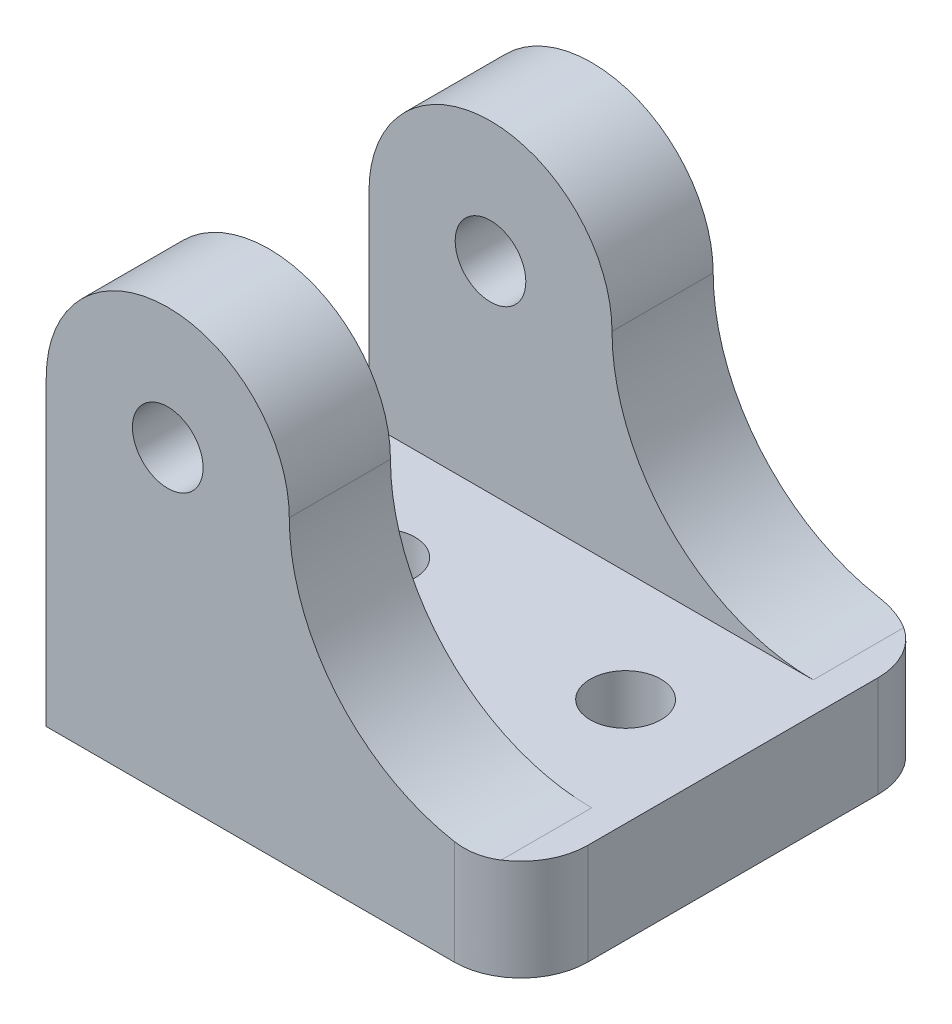
ISO-10303-21;
HEADER;
FILE_DESCRIPTION(('STEP AP214'),'2;1');
FILE_NAME('part.step','',(''),(''),'','','');
FILE_SCHEMA(('AUTOMOTIVE_DESIGN { 1 0 10303 214 1 1 1 1 }'));
ENDSEC;
DATA;
#1=APPLICATION_CONTEXT('core data for automotive mechanical design processes');
#2=APPLICATION_PROTOCOL_DEFINITION('international standard','automotive_design',2000,#1);
#3=PRODUCT_CONTEXT('',#1,'mechanical');
#4=PRODUCT('Part','Part','',(#3));
#5=PRODUCT_RELATED_PRODUCT_CATEGORY('part','',(#4));
#6=PRODUCT_DEFINITION_FORMATION('','',#4);
#7=PRODUCT_DEFINITION_CONTEXT('part definition',#1,'design');
#8=PRODUCT_DEFINITION('design','',#6,#7);
#9=PRODUCT_DEFINITION_SHAPE('','',#8);
#10=(LENGTH_UNIT() NAMED_UNIT(*) SI_UNIT(.MILLI.,.METRE.));
#11=(NAMED_UNIT(*) PLANE_ANGLE_UNIT() SI_UNIT($,.RADIAN.));
#12=(NAMED_UNIT(*) SI_UNIT($,.STERADIAN.) SOLID_ANGLE_UNIT());
#13=UNCERTAINTY_MEASURE_WITH_UNIT(LENGTH_MEASURE(1.E-05),#10,'distance_accuracy_value','');
#14=(GEOMETRIC_REPRESENTATION_CONTEXT(3) GLOBAL_UNCERTAINTY_ASSIGNED_CONTEXT((#13)) GLOBAL_UNIT_ASSIGNED_CONTEXT((#10,
#11,#12)) REPRESENTATION_CONTEXT('',''));
#15=CARTESIAN_POINT('',(0.,0.,0.));
#16=DIRECTION('',(0.,0.,1.));
#17=DIRECTION('',(1.,0.,0.));
#18=AXIS2_PLACEMENT_3D('',#15,#16,#17);
#19=CARTESIAN_POINT('',(-0.0100000000000031,9.09320000000001,-29.0068));
#20=DIRECTION('',(0.,0.,-1.));
#21=DIRECTION('',(-1.,0.,0.));
#22=AXIS2_PLACEMENT_3D('',#19,#20,#21);
#23=PLANE('',#22);
#24=CARTESIAN_POINT('',(10.922,27.178,-29.0068));
#25=DIRECTION('',(0.,0.,-1.));
#26=DIRECTION('',(-1.,0.,0.));
#27=AXIS2_PLACEMENT_3D('',#24,#25,#26);
#28=CIRCLE('',#27,10.922);
#29=CARTESIAN_POINT('',(0.,27.178,-29.0068));
#30=VERTEX_POINT('',#29);
#31=CARTESIAN_POINT('',(21.844,27.178,-29.0068));
#32=VERTEX_POINT('',#31);
#33=EDGE_CURVE('E225',#30,#32,#28,.T.);
#34=ORIENTED_EDGE('',*,*,#33,.F.);
#35=DIRECTION('',(0.,1.,0.));
#36=VECTOR('',#35,1.);
#37=CARTESIAN_POINT('',(0.,38.1,-29.0068));
#38=LINE('',#37,#36);
#39=CARTESIAN_POINT('',(0.,9.09320000000001,-29.0068));
#40=VERTEX_POINT('',#39);
#41=EDGE_CURVE('E253',#40,#30,#38,.T.);
#42=ORIENTED_EDGE('',*,*,#41,.F.);
#43=DIRECTION('',(1.,0.,0.));
#44=VECTOR('',#43,1.);
#45=CARTESIAN_POINT('',(-0.0100000000000031,9.09320000000001,-29.0068));
#46=LINE('',#45,#44);
#47=CARTESIAN_POINT('',(39.9288,9.0932,-29.0068));
#48=VERTEX_POINT('',#47);
#49=EDGE_CURVE('E11',#40,#48,#46,.T.);
#50=ORIENTED_EDGE('',*,*,#49,.T.);
#51=CARTESIAN_POINT('',(39.9288,27.178,-29.0068));
#52=DIRECTION('',(0.,0.,-1.));
#53=DIRECTION('',(-1.,0.,0.));
#54=AXIS2_PLACEMENT_3D('',#51,#52,#53);
#55=CIRCLE('',#54,18.0848);
#56=EDGE_CURVE('E236',#32,#48,#55,.F.);
#57=ORIENTED_EDGE('',*,*,#56,.F.);
#58=EDGE_LOOP('',(#34,#42,#50,#57));
#59=FACE_BOUND('',#58,.T.);
#60=CARTESIAN_POINT('',(10.922,27.178,-29.0068));
#61=DIRECTION('',(0.,0.,-1.));
#62=DIRECTION('',(-1.,0.,0.));
#63=AXIS2_PLACEMENT_3D('',#60,#61,#62);
#64=CIRCLE('',#63,3.175);
#65=CARTESIAN_POINT('',(7.747,27.178,-29.0068));
#66=VERTEX_POINT('',#65);
#67=EDGE_CURVE('E229',#66,#66,#64,.F.);
#68=ORIENTED_EDGE('',*,*,#67,.F.);
#69=EDGE_LOOP('',(#68));
#70=FACE_BOUND('',#69,.T.);
#71=ADVANCED_FACE('F39',(#59,#70),#23,.F.);
#72=CARTESIAN_POINT('',(-0.0100000000000031,9.0932,-9.0932));
#73=DIRECTION('',(0.,0.,1.));
#74=DIRECTION('',(1.,0.,0.));
#75=AXIS2_PLACEMENT_3D('',#72,#73,#74);
#76=PLANE('',#75);
#77=DIRECTION('',(1.,0.,0.));
#78=VECTOR('',#77,1.);
#79=CARTESIAN_POINT('',(-0.0100000000000031,9.0932,-9.0932));
#80=LINE('',#79,#78);
#81=CARTESIAN_POINT('',(0.,9.0932,-9.0932));
#82=VERTEX_POINT('',#81);
#83=CARTESIAN_POINT('',(39.9288,9.0932,-9.0932));
#84=VERTEX_POINT('',#83);
#85=EDGE_CURVE('E49',#82,#84,#80,.T.);
#86=ORIENTED_EDGE('',*,*,#85,.F.);
#87=DIRECTION('',(0.,-1.,0.));
#88=VECTOR('',#87,1.);
#89=CARTESIAN_POINT('',(0.,38.1,-9.0932));
#90=LINE('',#89,#88);
#91=CARTESIAN_POINT('',(0.,27.178,-9.0932));
#92=VERTEX_POINT('',#91);
#93=EDGE_CURVE('E246',#92,#82,#90,.T.);
#94=ORIENTED_EDGE('',*,*,#93,.F.);
#95=CARTESIAN_POINT('',(10.922,27.178,-9.0932));
#96=DIRECTION('',(0.,0.,1.));
#97=DIRECTION('',(1.,0.,0.));
#98=AXIS2_PLACEMENT_3D('',#95,#96,#97);
#99=CIRCLE('',#98,10.922);
#100=CARTESIAN_POINT('',(21.844,27.178,-9.0932));
#101=VERTEX_POINT('',#100);
#102=EDGE_CURVE('E240',#101,#92,#99,.T.);
#103=ORIENTED_EDGE('',*,*,#102,.F.);
#104=CARTESIAN_POINT('',(39.9288,27.178,-9.0932));
#105=DIRECTION('',(0.,0.,1.));
#106=DIRECTION('',(1.,0.,0.));
#107=AXIS2_PLACEMENT_3D('',#104,#105,#106);
#108=CIRCLE('',#107,18.0848);
#109=EDGE_CURVE('E231',#84,#101,#108,.F.);
#110=ORIENTED_EDGE('',*,*,#109,.F.);
#111=EDGE_LOOP('',(#86,#94,#103,#110));
#112=FACE_BOUND('',#111,.T.);
#113=CARTESIAN_POINT('',(10.922,27.178,-9.0932));
#114=DIRECTION('',(0.,0.,1.));
#115=DIRECTION('',(1.,0.,0.));
#116=AXIS2_PLACEMENT_3D('',#113,#114,#115);
#117=CIRCLE('',#116,3.175);
#118=CARTESIAN_POINT('',(14.097,27.178,-9.0932));
#119=VERTEX_POINT('',#118);
#120=EDGE_CURVE('E43',#119,#119,#117,.F.);
#121=ORIENTED_EDGE('',*,*,#120,.F.);
#122=EDGE_LOOP('',(#121));
#123=FACE_BOUND('',#122,.T.);
#124=ADVANCED_FACE('F41',(#112,#123),#76,.F.);
#125=CARTESIAN_POINT('',(39.9288,27.178,-38.11));
#126=DIRECTION('',(0.,0.,1.));
#127=DIRECTION('',(1.,0.,0.));
#128=AXIS2_PLACEMENT_3D('',#125,#126,#127);
#129=CYLINDRICAL_SURFACE('',#128,18.0848);
#130=DIRECTION('',(0.,0.,1.));
#131=VECTOR('',#130,1.);
#132=CARTESIAN_POINT('',(39.9288,9.0932,-38.11));
#133=LINE('',#132,#131);
#134=CARTESIAN_POINT('',(39.9288,9.0932,-0.960828068025463));
#135=VERTEX_POINT('',#134);
#136=EDGE_CURVE('E288',#84,#135,#133,.T.);
#137=ORIENTED_EDGE('',*,*,#136,.F.);
#138=ORIENTED_EDGE('',*,*,#109,.T.);
#139=DIRECTION('',(0.,0.,1.));
#140=VECTOR('',#139,1.);
#141=CARTESIAN_POINT('',(21.844,27.178,-38.11));
#142=LINE('',#141,#140);
#143=CARTESIAN_POINT('',(21.844,27.178,0.));
#144=VERTEX_POINT('',#143);
#145=EDGE_CURVE('E148',#101,#144,#142,.T.);
#146=ORIENTED_EDGE('',*,*,#145,.T.);
#147=CARTESIAN_POINT('',(39.9288,27.178,0.));
#148=DIRECTION('',(0.,0.,-1.));
#149=DIRECTION('',(-1.,0.,0.));
#150=AXIS2_PLACEMENT_3D('',#147,#148,#149);
#151=CIRCLE('',#150,18.0848);
#152=CARTESIAN_POINT('',(36.672,9.38886722743349,0.));
#153=VERTEX_POINT('',#152);
#154=EDGE_CURVE('E145',#153,#144,#151,.T.);
#155=ORIENTED_EDGE('',*,*,#154,.F.);
#156=CARTESIAN_POINT('',(39.9288,9.0932,-11.0391719319745));
#157=CARTESIAN_POINT('',(39.7924402433437,9.09318697038997,-11.127325586795));
#158=CARTESIAN_POINT('',(39.6524755261725,9.09474153564356,-11.2099124895688));
#159=CARTESIAN_POINT('',(39.3663794367836,9.10138469609647,-11.363451267791));
#160=CARTESIAN_POINT('',(39.2202478803368,9.10647339694532,-11.4344027953327));
#161=CARTESIAN_POINT('',(38.9230866084259,9.12057342311363,-11.5640693018072));
#162=CARTESIAN_POINT('',(38.7720643509565,9.1295790141122,-11.6228019839908));
#163=CARTESIAN_POINT('',(38.4660514896711,9.15180017150526,-11.7277866271927));
#164=CARTESIAN_POINT('',(38.3110610757799,9.16501553675575,-11.7740391843193));
#165=CARTESIAN_POINT('',(37.998153804524,9.19586080439806,-11.8538368353515));
#166=CARTESIAN_POINT('',(37.8402349191607,9.21349388053002,-11.8873727497328));
#167=CARTESIAN_POINT('',(37.5227040516666,9.25326000874969,-11.9415699517944));
#168=CARTESIAN_POINT('',(37.363091464809,9.27539472313032,-11.9622264720888));
#169=CARTESIAN_POINT('',(37.0435003322463,9.32411672245113,-11.9906350548511));
#170=CARTESIAN_POINT('',(36.8835220649198,9.35070131709926,-11.9983948835581));
#171=CARTESIAN_POINT('',(36.5641805117315,9.40820358806508,-12.0011570156808));
#172=CARTESIAN_POINT('',(36.4048174807116,9.43912289567951,-11.9961545039577));
#173=CARTESIAN_POINT('',(36.0872222244769,9.50517725853964,-11.9735641212278));
#174=CARTESIAN_POINT('',(35.9289966863939,9.54032803777208,-11.9559280232043));
#175=CARTESIAN_POINT('',(35.615286798571,9.61441157675016,-11.9083469436384));
#176=CARTESIAN_POINT('',(35.4598034522691,9.65334568832668,-11.8783975499634));
#177=CARTESIAN_POINT('',(34.9988762008526,9.77522762614291,-11.7706221520943));
#178=CARTESIAN_POINT('',(34.6987876656276,9.86329025134533,-11.67485645001));
#179=CARTESIAN_POINT('',(34.1024012365799,10.0544157153322,-11.4320439543167));
#180=CARTESIAN_POINT('',(33.8074169869221,10.1580621944639,-11.282259175212));
#181=CARTESIAN_POINT('',(33.2470687993763,10.3701351769769,-10.9374282490481));
#182=CARTESIAN_POINT('',(32.9817174334517,10.4785636821592,-10.7423629986583));
#183=CARTESIAN_POINT('',(32.4686857944916,10.7010444018354,-10.295978788911));
#184=CARTESIAN_POINT('',(32.2234878311343,10.8149684815427,-10.0417072095528));
#185=CARTESIAN_POINT('',(31.8906638253167,10.9772673072466,-9.62907358954777));
#186=CARTESIAN_POINT('',(31.7854889020948,11.0299701657304,-9.48621178572629));
#187=CARTESIAN_POINT('',(31.5876410078859,11.1312754470889,-9.1907448333452));
#188=CARTESIAN_POINT('',(31.4949616934537,11.1798799457819,-9.0381446869054));
#189=CARTESIAN_POINT('',(31.3245676653558,11.270883564417,-8.72688158489393));
#190=CARTESIAN_POINT('',(31.246611996535,11.3133792539763,-8.56837881753994));
#191=CARTESIAN_POINT('',(31.1045466261901,11.3919576491884,-8.24383880791543));
#192=CARTESIAN_POINT('',(31.0404295241993,11.4280437806509,-8.07780565045822));
#193=CARTESIAN_POINT('',(30.9269273679993,11.4926390475562,-7.73952216246381));
#194=CARTESIAN_POINT('',(30.8775278069348,11.5211556411326,-7.56727814292052));
#195=CARTESIAN_POINT('',(30.794168986283,11.5696418371411,-7.21792164431692));
#196=CARTESIAN_POINT('',(30.7602070161264,11.5896129399748,-7.04081002571719));
#197=CARTESIAN_POINT('',(30.7116275617811,11.618295445459,-6.70624875162267));
#198=CARTESIAN_POINT('',(30.6950965879045,11.6281173209367,-6.54916936800307));
#199=CARTESIAN_POINT('',(30.6744814862985,11.6403769982283,-6.23391398928341));
#200=CARTESIAN_POINT('',(30.6703961514926,11.6428155161386,-6.07573810202247));
#201=CARTESIAN_POINT('',(30.6747327849926,11.6402319482041,-5.75966177129119));
#202=CARTESIAN_POINT('',(30.6831516059268,11.6352117397656,-5.60176126851972));
#203=CARTESIAN_POINT('',(30.7123629618944,11.6178725502314,-5.28752010060434));
#204=CARTESIAN_POINT('',(30.733155246693,11.6055537167395,-5.13117940398069));
#205=CARTESIAN_POINT('',(30.7847090462318,11.5752307230204,-4.83346639923371));
#206=CARTESIAN_POINT('',(30.8145603115734,11.5577485064377,-4.69188214860051));
#207=CARTESIAN_POINT('',(30.8841737789357,11.5173379353169,-4.41195108929895));
#208=CARTESIAN_POINT('',(30.9239390710981,11.4944078828265,-4.27360530477571));
#209=CARTESIAN_POINT('',(31.0575098310438,11.4182162470043,-3.86468091111701));
#210=CARTESIAN_POINT('',(31.1656267057626,11.3575309328116,-3.60000809732347));
#211=CARTESIAN_POINT('',(31.4251520330183,11.2164468804368,-3.07376807861256));
#212=CARTESIAN_POINT('',(31.5790934966565,11.1349526860572,-2.8137618982684));
#213=CARTESIAN_POINT('',(31.9220249994878,10.9610802192527,-2.32200589956519));
#214=CARTESIAN_POINT('',(32.111031972583,10.8686966960265,-2.09026982346471));
#215=CARTESIAN_POINT('',(32.5464204178778,10.666634364639,-1.63051693794519));
#216=CARTESIAN_POINT('',(32.7970573348162,10.5562613639261,-1.40683181215652));
#217=CARTESIAN_POINT('',(33.3326516128212,10.3365503360322,-1.0039031220992));
#218=CARTESIAN_POINT('',(33.6176285700512,10.2272129385679,-0.824685113151421));
#219=CARTESIAN_POINT('',(34.0745015020069,10.0661493662796,-0.58846505163688));
#220=CARTESIAN_POINT('',(34.2364169472513,10.0115502791074,-0.513663817158376));
#221=CARTESIAN_POINT('',(34.5671062600485,9.90541154506352,-0.378497935705093));
#222=CARTESIAN_POINT('',(34.7358773655505,9.85387068626957,-0.318127540927678));
#223=CARTESIAN_POINT('',(35.0791147196062,9.75466911266976,-0.212517501771971));
#224=CARTESIAN_POINT('',(35.2535786724572,9.70700686021504,-0.167271838962673));
#225=CARTESIAN_POINT('',(35.6070089865267,9.61624084856504,-0.0925125264714736));
#226=CARTESIAN_POINT('',(35.7859750102823,9.57313674895609,-0.0629977013071764));
#227=CARTESIAN_POINT('',(36.1377294249429,9.49414898443348,-0.0213467506550752));
#228=CARTESIAN_POINT('',(36.3103638967858,9.45800838264338,-0.0083969501779644));
#229=CARTESIAN_POINT('',(36.6570808874163,9.39072862423719,0.00248741881093178));
#230=CARTESIAN_POINT('',(36.8311633688156,9.35958933890335,0.000422373819644705));
#231=CARTESIAN_POINT('',(37.1793501712005,9.30255202841934,-0.0189466841984419));
#232=CARTESIAN_POINT('',(37.3534544927413,9.27665418897232,-0.0362512370411428));
#233=CARTESIAN_POINT('',(37.700174301509,9.23019205790836,-0.0861577030590043));
#234=CARTESIAN_POINT('',(37.8727898477583,9.20962755390298,-0.118759006929149));
#235=CARTESIAN_POINT('',(38.2101228660794,9.17427598363487,-0.19798878155279));
#236=CARTESIAN_POINT('',(38.3749251802838,9.15934085500601,-0.244190621911634));
#237=CARTESIAN_POINT('',(38.7003085257112,9.13423546093151,-0.35063971553661));
#238=CARTESIAN_POINT('',(38.8608894459942,9.12406532059377,-0.410887337521756));
#239=CARTESIAN_POINT('',(39.1767974964467,9.10814915551315,-0.545141324193725));
#240=CARTESIAN_POINT('',(39.3321134211482,9.10241206174776,-0.619175092726892));
#241=CARTESIAN_POINT('',(39.6359020950768,9.09492917385287,-0.780332019000183));
#242=CARTESIAN_POINT('',(39.7843748027844,9.09318340393665,-0.867455256143835));
#243=CARTESIAN_POINT('',(39.9288,9.0932,-0.960828068025461));
#244=B_SPLINE_CURVE_WITH_KNOTS('',3,(#156,#157,#158,#159,#160,#161,#162,#163,#164,#165,#166,
#167,#168,#169,#170,#171,#172,#173,#174,#175,#176,#177,#178,#179,#180,#181,#182,#183,#184,#185,
#186,#187,#188,#189,#190,#191,#192,#193,#194,#195,#196,#197,#198,#199,#200,#201,#202,#203,#204,
#205,#206,#207,#208,#209,#210,#211,#212,#213,#214,#215,#216,#217,#218,#219,#220,#221,#222,#223,
#224,#225,#226,#227,#228,#229,#230,#231,#232,#233,#234,#235,#236,#237,#238,#239,#240,#241,#242,
#243),.UNSPECIFIED.,.F.,.F.,(4,2,2,2,2,2,2,2,2,2,2,2,2,2,2,2,2,2,2,2,2,2,2,2,2,2,2,2,2,2,2,2,2,
2,2,2,2,2,2,2,2,2,2,4),(0.,0.486986417659836,0.973987393930027,1.46027778882995,
1.94654495214495,2.43316246281856,2.91995999114767,3.40646426925791,3.89315212906171,
4.38170782301673,4.87043873031902,5.84739184080867,6.88310647702268,7.91925886651293,
9.02689940400775,9.58151016207155,10.1358383010788,10.680111199245,11.2240923107959,
11.767535440883,12.3108831150269,12.7849965666371,13.2590640335083,13.7330121949506,
14.2069507718251,14.6437017316777,15.0805889947126,15.9537361291581,16.8890119946705,
17.8247407066417,18.8811132539147,19.9380915012096,20.4970826911923,21.0558508626389,
21.6143964237287,22.1729002418058,22.7027597582747,23.2326056356855,23.7624702821233,
24.2923138246167,24.807044294666,25.321788278544,25.8375666000225,26.3533480504494),.UNSPECIFIED.);
#245=EDGE_CURVE('E131',#153,#135,#244,.T.);
#246=ORIENTED_EDGE('',*,*,#245,.T.);
#247=EDGE_LOOP('',(#137,#138,#146,#155,#246));
#248=FACE_BOUND('',#247,.T.);
#249=ADVANCED_FACE('F146',(#248),#129,.F.);
#250=CARTESIAN_POINT('',(21.844,27.178,-38.1));
#251=VERTEX_POINT('',#250);
#252=EDGE_CURVE('E169',#251,#32,#142,.T.);
#253=ORIENTED_EDGE('',*,*,#252,.T.);
#254=ORIENTED_EDGE('',*,*,#56,.T.);
#255=CARTESIAN_POINT('',(39.9288,9.0932,-37.1391719319745));
#256=VERTEX_POINT('',#255);
#257=EDGE_CURVE('E285',#256,#48,#133,.T.);
#258=ORIENTED_EDGE('',*,*,#257,.F.);
#259=CARTESIAN_POINT('',(39.9288,9.0932,-37.1391719319745));
#260=CARTESIAN_POINT('',(39.7924402433437,9.09318697038997,-37.227325586795));
#261=CARTESIAN_POINT('',(39.6524755261726,9.09474153564356,-37.3099124895688));
#262=CARTESIAN_POINT('',(39.3663794367836,9.10138469609647,-37.463451267791));
#263=CARTESIAN_POINT('',(39.2202478803368,9.10647339694532,-37.5344027953327));
#264=CARTESIAN_POINT('',(38.9230866084259,9.12057342311363,-37.6640693018072));
#265=CARTESIAN_POINT('',(38.7720643509565,9.1295790141122,-37.7228019839908));
#266=CARTESIAN_POINT('',(38.4660514896711,9.15180017150526,-37.8277866271927));
#267=CARTESIAN_POINT('',(38.3110610757799,9.16501553675575,-37.8740391843193));
#268=CARTESIAN_POINT('',(37.998153804524,9.19586080439806,-37.9538368353515));
#269=CARTESIAN_POINT('',(37.8402349191607,9.21349388053002,-37.9873727497328));
#270=CARTESIAN_POINT('',(37.5227040516666,9.25326000874969,-38.0415699517944));
#271=CARTESIAN_POINT('',(37.363091464809,9.27539472313032,-38.0622264720888));
#272=CARTESIAN_POINT('',(37.0435003322463,9.32411672245113,-38.0906350548511));
#273=CARTESIAN_POINT('',(36.8835220649198,9.35070131709926,-38.0983948835581));
#274=CARTESIAN_POINT('',(36.5641805117315,9.40820358806508,-38.1011570156808));
#275=CARTESIAN_POINT('',(36.4048174807116,9.43912289567951,-38.0961545039577));
#276=CARTESIAN_POINT('',(36.0872222244769,9.50517725853964,-38.0735641212278));
#277=CARTESIAN_POINT('',(35.9289966863939,9.54032803777208,-38.0559280232043));
#278=CARTESIAN_POINT('',(35.615286798571,9.61441157675016,-38.0083469436384));
#279=CARTESIAN_POINT('',(35.4598034522691,9.65334568832668,-37.9783975499634));
#280=CARTESIAN_POINT('',(34.9988762008526,9.77522762614291,-37.8706221520943));
#281=CARTESIAN_POINT('',(34.6987876656276,9.86329025134532,-37.77485645001));
#282=CARTESIAN_POINT('',(34.1024012365799,10.0544157153322,-37.5320439543167));
#283=CARTESIAN_POINT('',(33.8074169869221,10.1580621944639,-37.382259175212));
#284=CARTESIAN_POINT('',(33.2470687993763,10.3701351769769,-37.0374282490481));
#285=CARTESIAN_POINT('',(32.9817174334517,10.4785636821592,-36.8423629986583));
#286=CARTESIAN_POINT('',(32.4686857944916,10.7010444018354,-36.395978788911));
#287=CARTESIAN_POINT('',(32.2234878311343,10.8149684815427,-36.1417072095528));
#288=CARTESIAN_POINT('',(31.8906638253167,10.9772673072466,-35.7290735895478));
#289=CARTESIAN_POINT('',(31.7854889020948,11.0299701657304,-35.5862117857263));
#290=CARTESIAN_POINT('',(31.5876410078859,11.1312754470889,-35.2907448333452));
#291=CARTESIAN_POINT('',(31.4949616934537,11.1798799457819,-35.1381446869054));
#292=CARTESIAN_POINT('',(31.3245676653558,11.270883564417,-34.8268815848939));
#293=CARTESIAN_POINT('',(31.2466119965349,11.3133792539763,-34.6683788175399));
#294=CARTESIAN_POINT('',(31.1045466261901,11.3919576491884,-34.3438388079154));
#295=CARTESIAN_POINT('',(31.0404295241993,11.4280437806509,-34.1778056504582));
#296=CARTESIAN_POINT('',(30.9269273679993,11.4926390475562,-33.8395221624638));
#297=CARTESIAN_POINT('',(30.8775278069348,11.5211556411326,-33.6672781429205));
#298=CARTESIAN_POINT('',(30.794168986283,11.5696418371411,-33.3179216443169));
#299=CARTESIAN_POINT('',(30.7602070161264,11.5896129399748,-33.1408100257172));
#300=CARTESIAN_POINT('',(30.7116275617811,11.618295445459,-32.8062487516227));
#301=CARTESIAN_POINT('',(30.6950965879045,11.6281173209367,-32.6491693680031));
#302=CARTESIAN_POINT('',(30.6744814862985,11.6403769982283,-32.3339139892834));
#303=CARTESIAN_POINT('',(30.6703961514926,11.6428155161386,-32.1757381020225));
#304=CARTESIAN_POINT('',(30.6747327849926,11.6402319482041,-31.8596617712912));
#305=CARTESIAN_POINT('',(30.6831516059268,11.6352117397656,-31.7017612685197));
#306=CARTESIAN_POINT('',(30.7123629618944,11.6178725502314,-31.3875201006043));
#307=CARTESIAN_POINT('',(30.733155246693,11.6055537167394,-31.2311794039807));
#308=CARTESIAN_POINT('',(30.7847090462318,11.5752307230204,-30.9334663992337));
#309=CARTESIAN_POINT('',(30.8145603115734,11.5577485064377,-30.7918821486005));
#310=CARTESIAN_POINT('',(30.8841737789357,11.5173379353169,-30.511951089299));
#311=CARTESIAN_POINT('',(30.923939071098,11.4944078828265,-30.3736053047757));
#312=CARTESIAN_POINT('',(31.0575098310438,11.4182162470043,-29.964680911117));
#313=CARTESIAN_POINT('',(31.1656267057626,11.3575309328116,-29.7000080973235));
#314=CARTESIAN_POINT('',(31.4251520330182,11.2164468804368,-29.1737680786126));
#315=CARTESIAN_POINT('',(31.5790934966565,11.1349526860572,-28.9137618982684));
#316=CARTESIAN_POINT('',(31.9220249994878,10.9610802192527,-28.4220058995652));
#317=CARTESIAN_POINT('',(32.111031972583,10.8686966960265,-28.1902698234647));
#318=CARTESIAN_POINT('',(32.5464204178778,10.666634364639,-27.7305169379452));
#319=CARTESIAN_POINT('',(32.7970573348162,10.5562613639261,-27.5068318121565));
#320=CARTESIAN_POINT('',(33.3326516128212,10.3365503360322,-27.1039031220992));
#321=CARTESIAN_POINT('',(33.6176285700512,10.2272129385679,-26.9246851131514));
#322=CARTESIAN_POINT('',(34.0745015020069,10.0661493662796,-26.6884650516369));
#323=CARTESIAN_POINT('',(34.2364169472513,10.0115502791074,-26.6136638171584));
#324=CARTESIAN_POINT('',(34.5671062600485,9.90541154506352,-26.4784979357051));
#325=CARTESIAN_POINT('',(34.7358773655505,9.85387068626957,-26.4181275409277));
#326=CARTESIAN_POINT('',(35.0791147196062,9.75466911266976,-26.312517501772));
#327=CARTESIAN_POINT('',(35.2535786724572,9.70700686021504,-26.2672718389627));
#328=CARTESIAN_POINT('',(35.6070089865267,9.61624084856504,-26.1925125264715));
#329=CARTESIAN_POINT('',(35.7859750102823,9.5731367489561,-26.1629977013072));
#330=CARTESIAN_POINT('',(36.1377294249429,9.49414898443348,-26.1213467506551));
#331=CARTESIAN_POINT('',(36.3103638967858,9.45800838264338,-26.108396950178));
#332=CARTESIAN_POINT('',(36.6570808874163,9.39072862423719,-26.0975125811891));
#333=CARTESIAN_POINT('',(36.8311633688156,9.35958933890335,-26.0995776261804));
#334=CARTESIAN_POINT('',(37.1793501712005,9.30255202841934,-26.1189466841984));
#335=CARTESIAN_POINT('',(37.3534544927413,9.27665418897232,-26.1362512370411));
#336=CARTESIAN_POINT('',(37.7001743015089,9.23019205790836,-26.186157703059));
#337=CARTESIAN_POINT('',(37.8727898477583,9.20962755390298,-26.2187590069292));
#338=CARTESIAN_POINT('',(38.2101228660794,9.17427598363487,-26.2979887815528));
#339=CARTESIAN_POINT('',(38.3749251802838,9.15934085500601,-26.3441906219116));
#340=CARTESIAN_POINT('',(38.7003085257112,9.13423546093151,-26.4506397155366));
#341=CARTESIAN_POINT('',(38.8608894459942,9.12406532059377,-26.5108873375218));
#342=CARTESIAN_POINT('',(39.1767974964467,9.10814915551315,-26.6451413241937));
#343=CARTESIAN_POINT('',(39.3321134211482,9.10241206174776,-26.7191750927269));
#344=CARTESIAN_POINT('',(39.6359020950768,9.09492917385287,-26.8803320190002));
#345=CARTESIAN_POINT('',(39.7843748027844,9.09318340393664,-26.9674552561438));
#346=CARTESIAN_POINT('',(39.9288,9.0932,-27.0608280680255));
#347=B_SPLINE_CURVE_WITH_KNOTS('',3,(#259,#260,#261,#262,#263,#264,#265,#266,#267,#268,#269,
#270,#271,#272,#273,#274,#275,#276,#277,#278,#279,#280,#281,#282,#283,#284,#285,#286,#287,#288,
#289,#290,#291,#292,#293,#294,#295,#296,#297,#298,#299,#300,#301,#302,#303,#304,#305,#306,#307,
#308,#309,#310,#311,#312,#313,#314,#315,#316,#317,#318,#319,#320,#321,#322,#323,#324,#325,#326,
#327,#328,#329,#330,#331,#332,#333,#334,#335,#336,#337,#338,#339,#340,#341,#342,#343,#344,#345,
#346),.UNSPECIFIED.,.F.,.F.,(4,2,2,2,2,2,2,2,2,2,2,2,2,2,2,2,2,2,2,2,2,2,2,2,2,2,2,2,2,2,2,2,2,
2,2,2,2,2,2,2,2,2,2,4),(0.,0.48698641765983,0.973987393930026,1.46027778882994,1.94654495214495,
2.43316246281856,2.91995999114767,3.40646426925791,3.89315212906171,4.38170782301673,
4.87043873031902,5.84739184080866,6.88310647702267,7.91925886651293,9.02689940400774,
9.58151016207154,10.1358383010788,10.680111199245,11.2240923107959,11.767535440883,
12.3108831150269,12.7849965666371,13.2590640335083,13.7330121949506,14.2069507718251,
14.6437017316777,15.0805889947126,15.9537361291581,16.8890119946705,17.8247407066417,
18.8811132539147,19.9380915012096,20.4970826911923,21.0558508626389,21.6143964237288,
22.1729002418058,22.7027597582747,23.2326056356855,23.7624702821233,24.2923138246167,
24.807044294666,25.321788278544,25.8375666000225,26.3533480504494),.UNSPECIFIED.);
#348=CARTESIAN_POINT('',(36.672,9.38886722743349,-38.1));
#349=VERTEX_POINT('',#348);
#350=EDGE_CURVE('E191',#256,#349,#347,.T.);
#351=ORIENTED_EDGE('',*,*,#350,.T.);
#352=CARTESIAN_POINT('',(39.9288,27.178,-38.1));
#353=DIRECTION('',(0.,0.,1.));
#354=DIRECTION('',(1.,0.,0.));
#355=AXIS2_PLACEMENT_3D('',#352,#353,#354);
#356=CIRCLE('',#355,18.0848);
#357=EDGE_CURVE('E160',#251,#349,#356,.T.);
#358=ORIENTED_EDGE('',*,*,#357,.F.);
#359=EDGE_LOOP('',(#253,#254,#258,#351,#358));
#360=FACE_BOUND('',#359,.T.);
#361=ADVANCED_FACE('F180',(#360),#129,.F.);
#362=CARTESIAN_POINT('',(0.,38.1,0.));
#363=DIRECTION('',(0.,0.,-1.));
#364=DIRECTION('',(-1.,0.,0.));
#365=AXIS2_PLACEMENT_3D('',#362,#363,#364);
#366=PLANE('',#365);
#367=CARTESIAN_POINT('',(10.922,27.178,0.));
#368=DIRECTION('',(0.,0.,-1.));
#369=DIRECTION('',(-1.,0.,0.));
#370=AXIS2_PLACEMENT_3D('',#367,#368,#369);
#371=CIRCLE('',#370,3.175);
#372=CARTESIAN_POINT('',(7.747,27.178,0.));
#373=VERTEX_POINT('',#372);
#374=EDGE_CURVE('E284',#373,#373,#371,.T.);
#375=ORIENTED_EDGE('',*,*,#374,.T.);
#376=EDGE_LOOP('',(#375));
#377=FACE_BOUND('',#376,.T.);
#378=CARTESIAN_POINT('',(10.922,27.178,0.));
#379=DIRECTION('',(0.,0.,-1.));
#380=DIRECTION('',(-1.,0.,0.));
#381=AXIS2_PLACEMENT_3D('',#378,#379,#380);
#382=CIRCLE('',#381,10.922);
#383=CARTESIAN_POINT('',(0.,27.178,0.));
#384=VERTEX_POINT('',#383);
#385=EDGE_CURVE('E153',#144,#384,#382,.F.);
#386=ORIENTED_EDGE('',*,*,#385,.T.);
#387=DIRECTION('',(0.,-1.,0.));
#388=VECTOR('',#387,1.);
#389=CARTESIAN_POINT('',(0.,38.1,0.));
#390=LINE('',#389,#388);
#391=CARTESIAN_POINT('',(0.,0.,0.));
#392=VERTEX_POINT('',#391);
#393=EDGE_CURVE('E278',#384,#392,#390,.T.);
#394=ORIENTED_EDGE('',*,*,#393,.T.);
#395=DIRECTION('',(1.,0.,0.));
#396=VECTOR('',#395,1.);
#397=CARTESIAN_POINT('',(0.,0.,0.));
#398=LINE('',#397,#396);
#399=CARTESIAN_POINT('',(36.672,0.,0.));
#400=VERTEX_POINT('',#399);
#401=EDGE_CURVE('E158',#392,#400,#398,.T.);
#402=ORIENTED_EDGE('',*,*,#401,.T.);
#403=DIRECTION('',(0.,-1.,0.));
#404=VECTOR('',#403,1.);
#405=CARTESIAN_POINT('',(36.672,38.1,0.));
#406=LINE('',#405,#404);
#407=EDGE_CURVE('E136',#400,#153,#406,.F.);
#408=ORIENTED_EDGE('',*,*,#407,.T.);
#409=ORIENTED_EDGE('',*,*,#154,.T.);
#410=EDGE_LOOP('',(#386,#394,#402,#408,#409));
#411=FACE_BOUND('',#410,.T.);
#412=ADVANCED_FACE('F156',(#377,#411),#366,.F.);
#413=CARTESIAN_POINT('',(0.,0.,-38.1));
#414=DIRECTION('',(0.,-1.,0.));
#415=DIRECTION('',(0.,0.,-1.));
#416=AXIS2_PLACEMENT_3D('',#413,#414,#415);
#417=PLANE('',#416);
#418=CARTESIAN_POINT('',(10.922,0.,-19.05));
#419=DIRECTION('',(0.,1.,0.));
#420=DIRECTION('',(0.,0.,1.));
#421=AXIS2_PLACEMENT_3D('',#418,#419,#420);
#422=CIRCLE('',#421,3.175);
#423=CARTESIAN_POINT('',(10.922,0.,-22.225));
#424=VERTEX_POINT('',#423);
#425=EDGE_CURVE('E310',#424,#424,#422,.T.);
#426=ORIENTED_EDGE('',*,*,#425,.T.);
#427=EDGE_LOOP('',(#426));
#428=FACE_BOUND('',#427,.T.);
#429=DIRECTION('',(-1.,0.,0.));
#430=VECTOR('',#429,1.);
#431=CARTESIAN_POINT('',(0.,0.,-38.1));
#432=LINE('',#431,#430);
#433=CARTESIAN_POINT('',(36.672,0.,-38.1));
#434=VERTEX_POINT('',#433);
#435=CARTESIAN_POINT('',(0.,0.,-38.1));
#436=VERTEX_POINT('',#435);
#437=EDGE_CURVE('E277',#434,#436,#432,.T.);
#438=ORIENTED_EDGE('',*,*,#437,.F.);
#439=CARTESIAN_POINT('',(36.672,0.,-32.1));
#440=DIRECTION('',(0.,-1.,0.));
#441=DIRECTION('',(0.,0.,-1.));
#442=AXIS2_PLACEMENT_3D('',#439,#440,#441);
#443=CIRCLE('',#442,6.);
#444=CARTESIAN_POINT('',(42.672,0.,-32.1));
#445=VERTEX_POINT('',#444);
#446=EDGE_CURVE('E291',#434,#445,#443,.T.);
#447=ORIENTED_EDGE('',*,*,#446,.T.);
#448=DIRECTION('',(0.,0.,-1.));
#449=VECTOR('',#448,1.);
#450=CARTESIAN_POINT('',(42.672,0.,0.));
#451=LINE('',#450,#449);
#452=CARTESIAN_POINT('',(42.672,0.,-6.));
#453=VERTEX_POINT('',#452);
#454=EDGE_CURVE('E304',#453,#445,#451,.T.);
#455=ORIENTED_EDGE('',*,*,#454,.F.);
#456=CARTESIAN_POINT('',(36.672,0.,-6.));
#457=DIRECTION('',(0.,-1.,0.));
#458=DIRECTION('',(0.,0.,-1.));
#459=AXIS2_PLACEMENT_3D('',#456,#457,#458);
#460=CIRCLE('',#459,6.);
#461=EDGE_CURVE('E290',#453,#400,#460,.T.);
#462=ORIENTED_EDGE('',*,*,#461,.T.);
#463=ORIENTED_EDGE('',*,*,#401,.F.);
#464=DIRECTION('',(0.,0.,1.));
#465=VECTOR('',#464,1.);
#466=CARTESIAN_POINT('',(0.,0.,0.));
#467=LINE('',#466,#465);
#468=EDGE_CURVE('E308',#436,#392,#467,.T.);
#469=ORIENTED_EDGE('',*,*,#468,.F.);
#470=EDGE_LOOP('',(#438,#447,#455,#462,#463,#469));
#471=FACE_BOUND('',#470,.T.);
#472=CARTESIAN_POINT('',(33.02,0.,-19.05));
#473=DIRECTION('',(0.,1.,0.));
#474=DIRECTION('',(0.,0.,1.));
#475=AXIS2_PLACEMENT_3D('',#472,#473,#474);
#476=CIRCLE('',#475,3.175);
#477=CARTESIAN_POINT('',(33.02,0.,-22.225));
#478=VERTEX_POINT('',#477);
#479=EDGE_CURVE('E261',#478,#478,#476,.T.);
#480=ORIENTED_EDGE('',*,*,#479,.T.);
#481=EDGE_LOOP('',(#480));
#482=FACE_BOUND('',#481,.T.);
#483=ADVANCED_FACE('F212',(#428,#471,#482),#417,.T.);
#484=CARTESIAN_POINT('',(10.922,38.1,-19.05));
#485=DIRECTION('',(0.,-1.,0.));
#486=DIRECTION('',(0.,0.,-1.));
#487=AXIS2_PLACEMENT_3D('',#484,#485,#486);
#488=CYLINDRICAL_SURFACE('',#487,3.175);
#489=CARTESIAN_POINT('',(10.922,9.09320000000001,-19.05));
#490=DIRECTION('',(0.,-1.,0.));
#491=DIRECTION('',(0.,0.,-1.));
#492=AXIS2_PLACEMENT_3D('',#489,#490,#491);
#493=CIRCLE('',#492,3.175);
#494=CARTESIAN_POINT('',(10.922,9.09320000000001,-22.225));
#495=VERTEX_POINT('',#494);
#496=EDGE_CURVE('E257',#495,#495,#493,.T.);
#497=CARTESIAN_POINT('',(10.922,9.09320000000001,-22.225));
#498=CARTESIAN_POINT('',(10.922,8.99847916666667,-22.225));
#499=CARTESIAN_POINT('',(10.922,8.90375833333334,-22.225));
#500=CARTESIAN_POINT('',(10.922,8.71431666666667,-22.225));
#501=CARTESIAN_POINT('',(10.922,8.61959583333334,-22.225));
#502=CARTESIAN_POINT('',(10.922,8.43015416666667,-22.225));
#503=CARTESIAN_POINT('',(10.922,8.33543333333334,-22.225));
#504=CARTESIAN_POINT('',(10.922,8.14599166666667,-22.225));
#505=CARTESIAN_POINT('',(10.922,8.05127083333334,-22.225));
#506=CARTESIAN_POINT('',(10.922,7.86182916666667,-22.225));
#507=CARTESIAN_POINT('',(10.922,7.76710833333334,-22.225));
#508=CARTESIAN_POINT('',(10.922,7.57766666666667,-22.225));
#509=CARTESIAN_POINT('',(10.922,7.48294583333334,-22.225));
#510=CARTESIAN_POINT('',(10.922,7.29350416666667,-22.225));
#511=CARTESIAN_POINT('',(10.922,7.19878333333334,-22.225));
#512=CARTESIAN_POINT('',(10.922,7.00934166666667,-22.225));
#513=CARTESIAN_POINT('',(10.922,6.91462083333334,-22.225));
#514=CARTESIAN_POINT('',(10.922,6.72517916666667,-22.225));
#515=CARTESIAN_POINT('',(10.922,6.63045833333334,-22.225));
#516=CARTESIAN_POINT('',(10.922,6.44101666666667,-22.225));
#517=CARTESIAN_POINT('',(10.922,6.34629583333334,-22.225));
#518=CARTESIAN_POINT('',(10.922,6.15685416666667,-22.225));
#519=CARTESIAN_POINT('',(10.922,6.06213333333334,-22.225));
#520=CARTESIAN_POINT('',(10.922,5.87269166666667,-22.225));
#521=CARTESIAN_POINT('',(10.922,5.77797083333334,-22.225));
#522=CARTESIAN_POINT('',(10.922,5.58852916666667,-22.225));
#523=CARTESIAN_POINT('',(10.922,5.49380833333334,-22.225));
#524=CARTESIAN_POINT('',(10.922,5.30436666666667,-22.225));
#525=CARTESIAN_POINT('',(10.922,5.20964583333334,-22.225));
#526=CARTESIAN_POINT('',(10.922,5.02020416666667,-22.225));
#527=CARTESIAN_POINT('',(10.922,4.92548333333334,-22.225));
#528=CARTESIAN_POINT('',(10.922,4.73604166666667,-22.225));
#529=CARTESIAN_POINT('',(10.922,4.64132083333334,-22.225));
#530=CARTESIAN_POINT('',(10.922,4.45187916666667,-22.225));
#531=CARTESIAN_POINT('',(10.922,4.35715833333334,-22.225));
#532=CARTESIAN_POINT('',(10.922,4.16771666666667,-22.225));
#533=CARTESIAN_POINT('',(10.922,4.07299583333334,-22.225));
#534=CARTESIAN_POINT('',(10.922,3.88355416666667,-22.225));
#535=CARTESIAN_POINT('',(10.922,3.78883333333334,-22.225));
#536=CARTESIAN_POINT('',(10.922,3.59939166666667,-22.225));
#537=CARTESIAN_POINT('',(10.922,3.50467083333334,-22.225));
#538=CARTESIAN_POINT('',(10.922,3.31522916666667,-22.225));
#539=CARTESIAN_POINT('',(10.922,3.22050833333334,-22.225));
#540=CARTESIAN_POINT('',(10.922,3.03106666666667,-22.225));
#541=CARTESIAN_POINT('',(10.922,2.93634583333333,-22.225));
#542=CARTESIAN_POINT('',(10.922,2.74690416666667,-22.225));
#543=CARTESIAN_POINT('',(10.922,2.65218333333334,-22.225));
#544=CARTESIAN_POINT('',(10.922,2.46274166666667,-22.225));
#545=CARTESIAN_POINT('',(10.922,2.36802083333334,-22.225));
#546=CARTESIAN_POINT('',(10.922,2.17857916666667,-22.225));
#547=CARTESIAN_POINT('',(10.922,2.08385833333334,-22.225));
#548=CARTESIAN_POINT('',(10.922,1.89441666666667,-22.225));
#549=CARTESIAN_POINT('',(10.922,1.79969583333334,-22.225));
#550=CARTESIAN_POINT('',(10.922,1.61025416666667,-22.225));
#551=CARTESIAN_POINT('',(10.922,1.51553333333333,-22.225));
#552=CARTESIAN_POINT('',(10.922,1.32609166666667,-22.225));
#553=CARTESIAN_POINT('',(10.922,1.23137083333334,-22.225));
#554=CARTESIAN_POINT('',(10.922,1.04192916666667,-22.225));
#555=CARTESIAN_POINT('',(10.922,0.947208333333333,-22.225));
#556=CARTESIAN_POINT('',(10.922,0.757766666666666,-22.225));
#557=CARTESIAN_POINT('',(10.922,0.663045833333334,-22.225));
#558=CARTESIAN_POINT('',(10.922,0.473604166666669,-22.225));
#559=CARTESIAN_POINT('',(10.922,0.378883333333337,-22.225));
#560=CARTESIAN_POINT('',(10.922,0.189441666666669,-22.225));
#561=CARTESIAN_POINT('',(10.922,0.0947208333333347,-22.225));
#562=CARTESIAN_POINT('',(10.922,0.,-22.225));
#563=B_SPLINE_CURVE_WITH_KNOTS('',3,(#497,#498,#499,#500,#501,#502,#503,#504,#505,#506,#507,
#508,#509,#510,#511,#512,#513,#514,#515,#516,#517,#518,#519,#520,#521,#522,#523,#524,#525,#526,
#527,#528,#529,#530,#531,#532,#533,#534,#535,#536,#537,#538,#539,#540,#541,#542,#543,#544,#545,
#546,#547,#548,#549,#550,#551,#552,#553,#554,#555,#556,#557,#558,#559,#560,#561,#562),
.UNSPECIFIED.,.F.,.F.,(4,2,2,2,2,2,2,2,2,2,2,2,2,2,2,2,2,2,2,2,2,2,2,2,2,2,2,2,2,2,2,2,4),(0.,
0.284162500000001,0.568325000000002,0.852487500000002,1.13665,1.4208125,1.704975,1.9891375,
2.2733,2.5574625,2.841625,3.1257875,3.40995,3.6941125,3.978275,4.2624375,4.5466,4.8307625,
5.114925,5.3990875,5.68325,5.9674125,6.25157500000001,6.5357375,6.8199,7.1040625,7.388225,
7.67238750000001,7.95655,8.24071250000001,8.52487500000001,8.8090375,9.09320000000001),.UNSPECIFIED.);
#564=EDGE_CURVE('BSEAM209',#495,#424,#563,.T.);
#565=ORIENTED_EDGE('',*,*,#496,.F.);
#566=ORIENTED_EDGE('',*,*,#425,.F.);
#567=ORIENTED_EDGE('',*,*,#564,.T.);
#568=ORIENTED_EDGE('',*,*,#564,.F.);
#569=EDGE_LOOP('',(#565,#567,#566,#568));
#570=FACE_BOUND('',#569,.T.);
#571=ADVANCED_FACE('F209',(#570),#488,.F.);
#572=CARTESIAN_POINT('',(33.02,38.1,-19.05));
#573=DIRECTION('',(0.,-1.,0.));
#574=DIRECTION('',(0.,0.,-1.));
#575=AXIS2_PLACEMENT_3D('',#572,#573,#574);
#576=CYLINDRICAL_SURFACE('',#575,3.175);
#577=CARTESIAN_POINT('',(33.02,9.09320000000001,-19.05));
#578=DIRECTION('',(0.,-1.,0.));
#579=DIRECTION('',(0.,0.,-1.));
#580=AXIS2_PLACEMENT_3D('',#577,#578,#579);
#581=CIRCLE('',#580,3.175);
#582=CARTESIAN_POINT('',(33.02,9.09320000000001,-22.225));
#583=VERTEX_POINT('',#582);
#584=EDGE_CURVE('E234',#583,#583,#581,.T.);
#585=CARTESIAN_POINT('',(33.02,9.09320000000001,-22.225));
#586=CARTESIAN_POINT('',(33.02,8.99847916666667,-22.225));
#587=CARTESIAN_POINT('',(33.02,8.90375833333334,-22.225));
#588=CARTESIAN_POINT('',(33.02,8.71431666666667,-22.225));
#589=CARTESIAN_POINT('',(33.02,8.61959583333334,-22.225));
#590=CARTESIAN_POINT('',(33.02,8.43015416666667,-22.225));
#591=CARTESIAN_POINT('',(33.02,8.33543333333334,-22.225));
#592=CARTESIAN_POINT('',(33.02,8.14599166666667,-22.225));
#593=CARTESIAN_POINT('',(33.02,8.05127083333334,-22.225));
#594=CARTESIAN_POINT('',(33.02,7.86182916666667,-22.225));
#595=CARTESIAN_POINT('',(33.02,7.76710833333334,-22.225));
#596=CARTESIAN_POINT('',(33.02,7.57766666666667,-22.225));
#597=CARTESIAN_POINT('',(33.02,7.48294583333334,-22.225));
#598=CARTESIAN_POINT('',(33.02,7.29350416666667,-22.225));
#599=CARTESIAN_POINT('',(33.02,7.19878333333334,-22.225));
#600=CARTESIAN_POINT('',(33.02,7.00934166666667,-22.225));
#601=CARTESIAN_POINT('',(33.02,6.91462083333334,-22.225));
#602=CARTESIAN_POINT('',(33.02,6.72517916666667,-22.225));
#603=CARTESIAN_POINT('',(33.02,6.63045833333334,-22.225));
#604=CARTESIAN_POINT('',(33.02,6.44101666666667,-22.225));
#605=CARTESIAN_POINT('',(33.02,6.34629583333334,-22.225));
#606=CARTESIAN_POINT('',(33.02,6.15685416666667,-22.225));
#607=CARTESIAN_POINT('',(33.02,6.06213333333334,-22.225));
#608=CARTESIAN_POINT('',(33.02,5.87269166666667,-22.225));
#609=CARTESIAN_POINT('',(33.02,5.77797083333334,-22.225));
#610=CARTESIAN_POINT('',(33.02,5.58852916666667,-22.225));
#611=CARTESIAN_POINT('',(33.02,5.49380833333334,-22.225));
#612=CARTESIAN_POINT('',(33.02,5.30436666666667,-22.225));
#613=CARTESIAN_POINT('',(33.02,5.20964583333334,-22.225));
#614=CARTESIAN_POINT('',(33.02,5.02020416666667,-22.225));
#615=CARTESIAN_POINT('',(33.02,4.92548333333334,-22.225));
#616=CARTESIAN_POINT('',(33.02,4.73604166666667,-22.225));
#617=CARTESIAN_POINT('',(33.02,4.64132083333334,-22.225));
#618=CARTESIAN_POINT('',(33.02,4.45187916666667,-22.225));
#619=CARTESIAN_POINT('',(33.02,4.35715833333334,-22.225));
#620=CARTESIAN_POINT('',(33.02,4.16771666666667,-22.225));
#621=CARTESIAN_POINT('',(33.02,4.07299583333334,-22.225));
#622=CARTESIAN_POINT('',(33.02,3.88355416666667,-22.225));
#623=CARTESIAN_POINT('',(33.02,3.78883333333334,-22.225));
#624=CARTESIAN_POINT('',(33.02,3.59939166666667,-22.225));
#625=CARTESIAN_POINT('',(33.02,3.50467083333334,-22.225));
#626=CARTESIAN_POINT('',(33.02,3.31522916666667,-22.225));
#627=CARTESIAN_POINT('',(33.02,3.22050833333334,-22.225));
#628=CARTESIAN_POINT('',(33.02,3.03106666666667,-22.225));
#629=CARTESIAN_POINT('',(33.02,2.93634583333333,-22.225));
#630=CARTESIAN_POINT('',(33.02,2.74690416666667,-22.225));
#631=CARTESIAN_POINT('',(33.02,2.65218333333334,-22.225));
#632=CARTESIAN_POINT('',(33.02,2.46274166666667,-22.225));
#633=CARTESIAN_POINT('',(33.02,2.36802083333334,-22.225));
#634=CARTESIAN_POINT('',(33.02,2.17857916666667,-22.225));
#635=CARTESIAN_POINT('',(33.02,2.08385833333334,-22.225));
#636=CARTESIAN_POINT('',(33.02,1.89441666666667,-22.225));
#637=CARTESIAN_POINT('',(33.02,1.79969583333334,-22.225));
#638=CARTESIAN_POINT('',(33.02,1.61025416666667,-22.225));
#639=CARTESIAN_POINT('',(33.02,1.51553333333333,-22.225));
#640=CARTESIAN_POINT('',(33.02,1.32609166666667,-22.225));
#641=CARTESIAN_POINT('',(33.02,1.23137083333334,-22.225));
#642=CARTESIAN_POINT('',(33.02,1.04192916666667,-22.225));
#643=CARTESIAN_POINT('',(33.02,0.947208333333333,-22.225));
#644=CARTESIAN_POINT('',(33.02,0.757766666666666,-22.225));
#645=CARTESIAN_POINT('',(33.02,0.663045833333334,-22.225));
#646=CARTESIAN_POINT('',(33.02,0.473604166666669,-22.225));
#647=CARTESIAN_POINT('',(33.02,0.378883333333337,-22.225));
#648=CARTESIAN_POINT('',(33.02,0.189441666666669,-22.225));
#649=CARTESIAN_POINT('',(33.02,0.0947208333333347,-22.225));
#650=CARTESIAN_POINT('',(33.02,0.,-22.225));
#651=B_SPLINE_CURVE_WITH_KNOTS('',3,(#585,#586,#587,#588,#589,#590,#591,#592,#593,#594,#595,
#596,#597,#598,#599,#600,#601,#602,#603,#604,#605,#606,#607,#608,#609,#610,#611,#612,#613,#614,
#615,#616,#617,#618,#619,#620,#621,#622,#623,#624,#625,#626,#627,#628,#629,#630,#631,#632,#633,
#634,#635,#636,#637,#638,#639,#640,#641,#642,#643,#644,#645,#646,#647,#648,#649,#650),
.UNSPECIFIED.,.F.,.F.,(4,2,2,2,2,2,2,2,2,2,2,2,2,2,2,2,2,2,2,2,2,2,2,2,2,2,2,2,2,2,2,2,4),(0.,
0.284162500000001,0.568325000000002,0.852487500000002,1.13665,1.4208125,1.704975,1.9891375,
2.2733,2.5574625,2.841625,3.1257875,3.40995,3.6941125,3.978275,4.2624375,4.5466,4.8307625,
5.114925,5.3990875,5.68325,5.9674125,6.25157500000001,6.5357375,6.8199,7.1040625,7.388225,
7.67238750000001,7.95655,8.24071250000001,8.52487500000001,8.8090375,9.09320000000001),.UNSPECIFIED.);
#652=EDGE_CURVE('BSEAM206',#583,#478,#651,.T.);
#653=ORIENTED_EDGE('',*,*,#584,.F.);
#654=ORIENTED_EDGE('',*,*,#479,.F.);
#655=ORIENTED_EDGE('',*,*,#652,.T.);
#656=ORIENTED_EDGE('',*,*,#652,.F.);
#657=EDGE_LOOP('',(#653,#655,#654,#656));
#658=FACE_BOUND('',#657,.T.);
#659=ADVANCED_FACE('F206',(#658),#576,.F.);
#660=CARTESIAN_POINT('',(36.672,38.1,-6.));
#661=DIRECTION('',(0.,-1.,0.));
#662=DIRECTION('',(0.,0.,-1.));
#663=AXIS2_PLACEMENT_3D('',#660,#661,#662);
#664=CYLINDRICAL_SURFACE('',#663,6.);
#665=ORIENTED_EDGE('',*,*,#245,.F.);
#666=ORIENTED_EDGE('',*,*,#407,.F.);
#667=ORIENTED_EDGE('',*,*,#461,.F.);
#668=DIRECTION('',(0.,-1.,0.));
#669=VECTOR('',#668,1.);
#670=CARTESIAN_POINT('',(42.672,38.1,-6.));
#671=LINE('',#670,#669);
#672=CARTESIAN_POINT('',(42.672,9.0932,-6.));
#673=VERTEX_POINT('',#672);
#674=EDGE_CURVE('E163',#673,#453,#671,.T.);
#675=ORIENTED_EDGE('',*,*,#674,.F.);
#676=CARTESIAN_POINT('',(36.672,9.0932,-6.));
#677=DIRECTION('',(0.,-1.,0.));
#678=DIRECTION('',(1.,0.,0.));
#679=AXIS2_PLACEMENT_3D('',#676,#677,#678);
#680=CIRCLE('',#679,6.);
#681=EDGE_CURVE('E139',#135,#673,#680,.F.);
#682=ORIENTED_EDGE('',*,*,#681,.F.);
#683=EDGE_LOOP('',(#665,#666,#667,#675,#682));
#684=FACE_BOUND('',#683,.T.);
#685=ADVANCED_FACE('F133',(#684),#664,.T.);
#686=CARTESIAN_POINT('',(39.9288,9.0932,-38.11));
#687=DIRECTION('',(0.,-1.,0.));
#688=DIRECTION('',(1.,0.,0.));
#689=AXIS2_PLACEMENT_3D('',#686,#687,#688);
#690=PLANE('',#689);
#691=ORIENTED_EDGE('',*,*,#257,.T.);
#692=ORIENTED_EDGE('',*,*,#49,.F.);
#693=DIRECTION('',(0.,0.,-1.));
#694=VECTOR('',#693,1.);
#695=CARTESIAN_POINT('',(0.,9.0932,0.));
#696=LINE('',#695,#694);
#697=EDGE_CURVE('E57',#82,#40,#696,.T.);
#698=ORIENTED_EDGE('',*,*,#697,.F.);
#699=ORIENTED_EDGE('',*,*,#85,.T.);
#700=ORIENTED_EDGE('',*,*,#136,.T.);
#701=ORIENTED_EDGE('',*,*,#681,.T.);
#702=DIRECTION('',(0.,0.,1.));
#703=VECTOR('',#702,1.);
#704=CARTESIAN_POINT('',(42.672,9.0932,0.));
#705=LINE('',#704,#703);
#706=CARTESIAN_POINT('',(42.672,9.0932,-32.1));
#707=VERTEX_POINT('',#706);
#708=EDGE_CURVE('E152',#707,#673,#705,.T.);
#709=ORIENTED_EDGE('',*,*,#708,.F.);
#710=CARTESIAN_POINT('',(36.672,9.0932,-32.1));
#711=DIRECTION('',(0.,-1.,0.));
#712=DIRECTION('',(1.,0.,0.));
#713=AXIS2_PLACEMENT_3D('',#710,#711,#712);
#714=CIRCLE('',#713,6.);
#715=EDGE_CURVE('E142',#707,#256,#714,.F.);
#716=ORIENTED_EDGE('',*,*,#715,.T.);
#717=EDGE_LOOP('',(#691,#692,#698,#699,#700,#701,#709,#716));
#718=FACE_BOUND('',#717,.T.);
#719=ORIENTED_EDGE('',*,*,#496,.T.);
#720=EDGE_LOOP('',(#719));
#721=FACE_BOUND('',#720,.T.);
#722=ORIENTED_EDGE('',*,*,#584,.T.);
#723=EDGE_LOOP('',(#722));
#724=FACE_BOUND('',#723,.T.);
#725=ADVANCED_FACE('F186',(#718,#721,#724),#690,.F.);
#726=CARTESIAN_POINT('',(36.672,38.1,-32.1));
#727=DIRECTION('',(0.,-1.,0.));
#728=DIRECTION('',(0.,0.,-1.));
#729=AXIS2_PLACEMENT_3D('',#726,#727,#728);
#730=CYLINDRICAL_SURFACE('',#729,6.);
#731=ORIENTED_EDGE('',*,*,#350,.F.);
#732=ORIENTED_EDGE('',*,*,#715,.F.);
#733=DIRECTION('',(0.,-1.,0.));
#734=VECTOR('',#733,1.);
#735=CARTESIAN_POINT('',(42.672,38.1,-32.1));
#736=LINE('',#735,#734);
#737=EDGE_CURVE('E159',#445,#707,#736,.F.);
#738=ORIENTED_EDGE('',*,*,#737,.F.);
#739=ORIENTED_EDGE('',*,*,#446,.F.);
#740=DIRECTION('',(0.,-1.,0.));
#741=VECTOR('',#740,1.);
#742=CARTESIAN_POINT('',(36.672,38.1,-38.1));
#743=LINE('',#742,#741);
#744=EDGE_CURVE('E280',#349,#434,#743,.T.);
#745=ORIENTED_EDGE('',*,*,#744,.F.);
#746=EDGE_LOOP('',(#731,#732,#738,#739,#745));
#747=FACE_BOUND('',#746,.T.);
#748=ADVANCED_FACE('F199',(#747),#730,.T.);
#749=CARTESIAN_POINT('',(42.672,38.1,0.));
#750=DIRECTION('',(-1.,0.,0.));
#751=DIRECTION('',(0.,0.,1.));
#752=AXIS2_PLACEMENT_3D('',#749,#750,#751);
#753=PLANE('',#752);
#754=ORIENTED_EDGE('',*,*,#737,.T.);
#755=ORIENTED_EDGE('',*,*,#708,.T.);
#756=ORIENTED_EDGE('',*,*,#674,.T.);
#757=ORIENTED_EDGE('',*,*,#454,.T.);
#758=EDGE_LOOP('',(#754,#755,#756,#757));
#759=FACE_BOUND('',#758,.T.);
#760=ADVANCED_FACE('F203',(#759),#753,.F.);
#761=CARTESIAN_POINT('',(0.,38.1,-38.1));
#762=DIRECTION('',(0.,0.,1.));
#763=DIRECTION('',(1.,0.,0.));
#764=AXIS2_PLACEMENT_3D('',#761,#762,#763);
#765=PLANE('',#764);
#766=CARTESIAN_POINT('',(10.922,27.178,-38.1));
#767=DIRECTION('',(0.,0.,1.));
#768=DIRECTION('',(1.,0.,0.));
#769=AXIS2_PLACEMENT_3D('',#766,#767,#768);
#770=CIRCLE('',#769,3.175);
#771=CARTESIAN_POINT('',(14.097,27.178,-38.1));
#772=VERTEX_POINT('',#771);
#773=EDGE_CURVE('E266',#772,#772,#770,.T.);
#774=ORIENTED_EDGE('',*,*,#773,.T.);
#775=EDGE_LOOP('',(#774));
#776=FACE_BOUND('',#775,.T.);
#777=DIRECTION('',(0.,-1.,0.));
#778=VECTOR('',#777,1.);
#779=CARTESIAN_POINT('',(0.,38.1,-38.1));
#780=LINE('',#779,#778);
#781=CARTESIAN_POINT('',(0.,27.178,-38.1));
#782=VERTEX_POINT('',#781);
#783=EDGE_CURVE('E275',#782,#436,#780,.T.);
#784=ORIENTED_EDGE('',*,*,#783,.F.);
#785=CARTESIAN_POINT('',(10.922,27.178,-38.1));
#786=DIRECTION('',(0.,0.,1.));
#787=DIRECTION('',(1.,0.,0.));
#788=AXIS2_PLACEMENT_3D('',#785,#786,#787);
#789=CIRCLE('',#788,10.922);
#790=EDGE_CURVE('E165',#782,#251,#789,.F.);
#791=ORIENTED_EDGE('',*,*,#790,.T.);
#792=ORIENTED_EDGE('',*,*,#357,.T.);
#793=ORIENTED_EDGE('',*,*,#744,.T.);
#794=ORIENTED_EDGE('',*,*,#437,.T.);
#795=EDGE_LOOP('',(#784,#791,#792,#793,#794));
#796=FACE_BOUND('',#795,.T.);
#797=ADVANCED_FACE('F205',(#776,#796),#765,.F.);
#798=CARTESIAN_POINT('',(10.922,27.178,-38.11));
#799=DIRECTION('',(0.,0.,1.));
#800=DIRECTION('',(1.,0.,0.));
#801=AXIS2_PLACEMENT_3D('',#798,#799,#800);
#802=CYLINDRICAL_SURFACE('',#801,10.922);
#803=ORIENTED_EDGE('',*,*,#33,.T.);
#804=ORIENTED_EDGE('',*,*,#252,.F.);
#805=ORIENTED_EDGE('',*,*,#790,.F.);
#806=DIRECTION('',(0.,0.,1.));
#807=VECTOR('',#806,1.);
#808=CARTESIAN_POINT('',(0.,27.178,-38.11));
#809=LINE('',#808,#807);
#810=EDGE_CURVE('E198',#30,#782,#809,.F.);
#811=ORIENTED_EDGE('',*,*,#810,.F.);
#812=EDGE_LOOP('',(#803,#804,#805,#811));
#813=FACE_BOUND('',#812,.T.);
#814=ADVANCED_FACE('F188',(#813),#802,.T.);
#815=ORIENTED_EDGE('',*,*,#102,.T.);
#816=EDGE_CURVE('E281',#384,#92,#809,.F.);
#817=ORIENTED_EDGE('',*,*,#816,.F.);
#818=ORIENTED_EDGE('',*,*,#385,.F.);
#819=ORIENTED_EDGE('',*,*,#145,.F.);
#820=EDGE_LOOP('',(#815,#817,#818,#819));
#821=FACE_BOUND('',#820,.T.);
#822=ADVANCED_FACE('F331',(#821),#802,.T.);
#823=CARTESIAN_POINT('',(0.,38.1,0.));
#824=DIRECTION('',(1.,0.,0.));
#825=DIRECTION('',(0.,0.,-1.));
#826=AXIS2_PLACEMENT_3D('',#823,#824,#825);
#827=PLANE('',#826);
#828=ORIENTED_EDGE('',*,*,#816,.T.);
#829=ORIENTED_EDGE('',*,*,#93,.T.);
#830=ORIENTED_EDGE('',*,*,#697,.T.);
#831=ORIENTED_EDGE('',*,*,#41,.T.);
#832=ORIENTED_EDGE('',*,*,#810,.T.);
#833=ORIENTED_EDGE('',*,*,#783,.T.);
#834=ORIENTED_EDGE('',*,*,#468,.T.);
#835=ORIENTED_EDGE('',*,*,#393,.F.);
#836=EDGE_LOOP('',(#828,#829,#830,#831,#832,#833,#834,#835));
#837=FACE_BOUND('',#836,.T.);
#838=ADVANCED_FACE('F329',(#837),#827,.F.);
#839=CARTESIAN_POINT('',(10.922,27.178,-38.11));
#840=DIRECTION('',(0.,0.,1.));
#841=DIRECTION('',(1.,0.,0.));
#842=AXIS2_PLACEMENT_3D('',#839,#840,#841);
#843=CYLINDRICAL_SURFACE('',#842,3.175);
#844=ORIENTED_EDGE('',*,*,#67,.T.);
#845=EDGE_LOOP('',(#844));
#846=FACE_BOUND('',#845,.T.);
#847=ORIENTED_EDGE('',*,*,#773,.F.);
#848=EDGE_LOOP('',(#847));
#849=FACE_BOUND('',#848,.T.);
#850=ADVANCED_FACE('F327',(#846,#849),#843,.F.);
#851=ORIENTED_EDGE('',*,*,#120,.T.);
#852=EDGE_LOOP('',(#851));
#853=FACE_BOUND('',#852,.T.);
#854=ORIENTED_EDGE('',*,*,#374,.F.);
#855=EDGE_LOOP('',(#854));
#856=FACE_BOUND('',#855,.T.);
#857=ADVANCED_FACE('F220',(#853,#856),#843,.F.);
#858=CLOSED_SHELL('',(#71,#124,#249,#361,#412,#483,#571,#659,#685,#725,#748,#760,#797,#814,#822,
#838,#850,#857));
#859=MANIFOLD_SOLID_BREP('B2',#858);
#860=ADVANCED_BREP_SHAPE_REPRESENTATION('',(#18,#859),#14);
#861=SHAPE_DEFINITION_REPRESENTATION(#9,#860);
ENDSEC;
END-ISO-10303-21;
